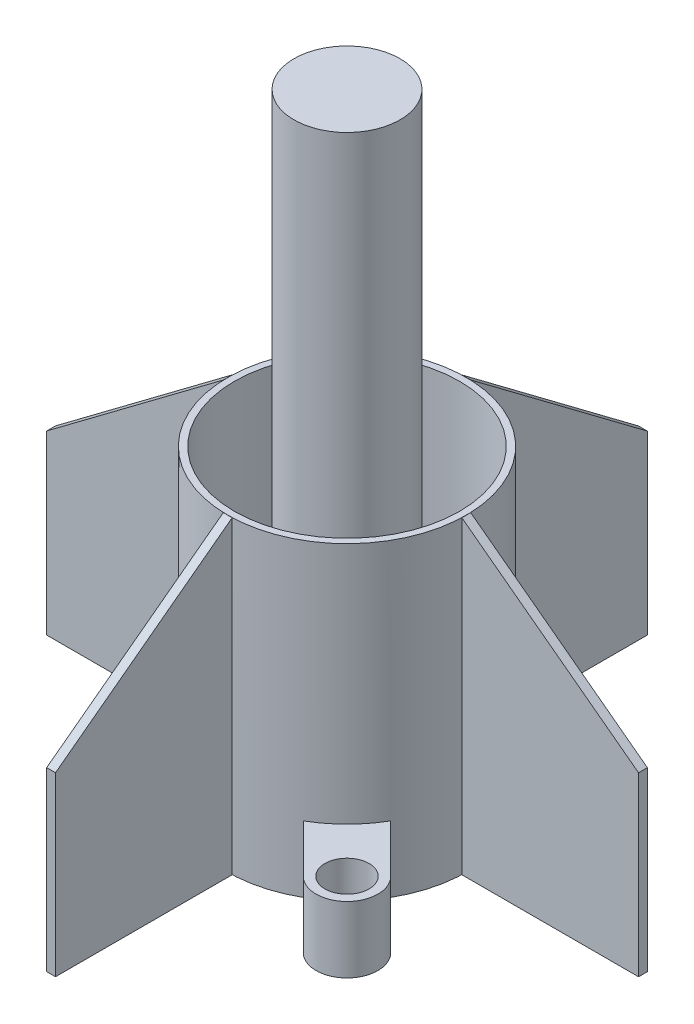
ISO-10303-21;
HEADER;
FILE_DESCRIPTION(('STEP AP214'),'2;1');
FILE_NAME('part.step','',(''),(''),'','','');
FILE_SCHEMA(('AUTOMOTIVE_DESIGN { 1 0 10303 214 1 1 1 1 }'));
ENDSEC;
DATA;
#1=APPLICATION_CONTEXT('core data for automotive mechanical design processes');
#2=APPLICATION_PROTOCOL_DEFINITION('international standard','automotive_design',2000,#1);
#3=PRODUCT_CONTEXT('',#1,'mechanical');
#4=PRODUCT('Part','Part','',(#3));
#5=PRODUCT_RELATED_PRODUCT_CATEGORY('part','',(#4));
#6=PRODUCT_DEFINITION_FORMATION('','',#4);
#7=PRODUCT_DEFINITION_CONTEXT('part definition',#1,'design');
#8=PRODUCT_DEFINITION('design','',#6,#7);
#9=PRODUCT_DEFINITION_SHAPE('','',#8);
#10=(LENGTH_UNIT() NAMED_UNIT(*) SI_UNIT(.MILLI.,.METRE.));
#11=(NAMED_UNIT(*) PLANE_ANGLE_UNIT() SI_UNIT($,.RADIAN.));
#12=(NAMED_UNIT(*) SI_UNIT($,.STERADIAN.) SOLID_ANGLE_UNIT());
#13=UNCERTAINTY_MEASURE_WITH_UNIT(LENGTH_MEASURE(1.E-05),#10,'distance_accuracy_value','');
#14=(GEOMETRIC_REPRESENTATION_CONTEXT(3) GLOBAL_UNCERTAINTY_ASSIGNED_CONTEXT((#13)) GLOBAL_UNIT_ASSIGNED_CONTEXT((#10,
#11,#12)) REPRESENTATION_CONTEXT('',''));
#15=CARTESIAN_POINT('',(0.,0.,0.));
#16=DIRECTION('',(0.,0.,1.));
#17=DIRECTION('',(1.,0.,0.));
#18=AXIS2_PLACEMENT_3D('',#15,#16,#17);
#19=CARTESIAN_POINT('',(1.,0.,-66.9852538505004));
#20=DIRECTION('',(0.,1.,0.));
#21=DIRECTION('',(0.,0.,1.));
#22=AXIS2_PLACEMENT_3D('',#19,#20,#21);
#23=PLANE('',#22);
#24=DIRECTION('',(0.,0.,-1.));
#25=VECTOR('',#24,1.);
#26=CARTESIAN_POINT('',(-1.,0.,-66.9852538505004));
#27=LINE('',#26,#25);
#28=CARTESIAN_POINT('',(-1.,0.,-27.));
#29=VERTEX_POINT('',#28);
#30=CARTESIAN_POINT('',(-1.,0.,-66.9852538505004));
#31=VERTEX_POINT('',#30);
#32=EDGE_CURVE('E115',#29,#31,#27,.T.);
#33=ORIENTED_EDGE('',*,*,#32,.T.);
#34=DIRECTION('',(-1.,0.,0.));
#35=VECTOR('',#34,1.);
#36=CARTESIAN_POINT('',(1.,0.,-66.9852538505004));
#37=LINE('',#36,#35);
#38=CARTESIAN_POINT('',(1.,0.,-66.9852538505004));
#39=VERTEX_POINT('',#38);
#40=EDGE_CURVE('E12',#39,#31,#37,.T.);
#41=ORIENTED_EDGE('',*,*,#40,.F.);
#42=DIRECTION('',(0.,0.,-1.));
#43=VECTOR('',#42,1.);
#44=CARTESIAN_POINT('',(1.,0.,-66.9852538505004));
#45=LINE('',#44,#43);
#46=CARTESIAN_POINT('',(1.,0.,-27.));
#47=VERTEX_POINT('',#46);
#48=EDGE_CURVE('E102',#47,#39,#45,.T.);
#49=ORIENTED_EDGE('',*,*,#48,.F.);
#50=DIRECTION('',(-1.,0.,0.));
#51=VECTOR('',#50,1.);
#52=CARTESIAN_POINT('',(1.,0.,-27.));
#53=LINE('',#52,#51);
#54=EDGE_CURVE('E92',#47,#29,#53,.T.);
#55=ORIENTED_EDGE('',*,*,#54,.T.);
#56=EDGE_LOOP('',(#33,#41,#49,#55));
#57=FACE_BOUND('',#56,.T.);
#58=ADVANCED_FACE('F53',(#57),#23,.F.);
#59=CARTESIAN_POINT('',(1.,40.,-66.9852538505004));
#60=DIRECTION('',(0.,0.,1.));
#61=DIRECTION('',(1.,0.,0.));
#62=AXIS2_PLACEMENT_3D('',#59,#60,#61);
#63=PLANE('',#62);
#64=DIRECTION('',(0.,1.,0.));
#65=VECTOR('',#64,1.);
#66=CARTESIAN_POINT('',(-1.,40.,-66.9852538505004));
#67=LINE('',#66,#65);
#68=CARTESIAN_POINT('',(-1.,40.,-66.9852538505004));
#69=VERTEX_POINT('',#68);
#70=EDGE_CURVE('E107',#31,#69,#67,.T.);
#71=ORIENTED_EDGE('',*,*,#70,.T.);
#72=DIRECTION('',(-1.,0.,0.));
#73=VECTOR('',#72,1.);
#74=CARTESIAN_POINT('',(1.,40.,-66.9852538505004));
#75=LINE('',#74,#73);
#76=CARTESIAN_POINT('',(1.,40.,-66.9852538505004));
#77=VERTEX_POINT('',#76);
#78=EDGE_CURVE('E61',#77,#69,#75,.T.);
#79=ORIENTED_EDGE('',*,*,#78,.F.);
#80=DIRECTION('',(0.,1.,0.));
#81=VECTOR('',#80,1.);
#82=CARTESIAN_POINT('',(1.,40.,-66.9852538505004));
#83=LINE('',#82,#81);
#84=EDGE_CURVE('E98',#39,#77,#83,.T.);
#85=ORIENTED_EDGE('',*,*,#84,.F.);
#86=ORIENTED_EDGE('',*,*,#40,.T.);
#87=EDGE_LOOP('',(#71,#79,#85,#86));
#88=FACE_BOUND('',#87,.T.);
#89=ADVANCED_FACE('F106',(#88),#63,.F.);
#90=CARTESIAN_POINT('',(1.,70.,-27.));
#91=DIRECTION('',(0.,-0.799893790138269,0.600141587042787));
#92=DIRECTION('',(0.,-0.600141587042787,-0.799893790138269));
#93=AXIS2_PLACEMENT_3D('',#90,#91,#92);
#94=PLANE('',#93);
#95=DIRECTION('',(0.,0.600141587042787,0.799893790138268));
#96=VECTOR('',#95,1.);
#97=CARTESIAN_POINT('',(-1.,70.,-27.));
#98=LINE('',#97,#96);
#99=CARTESIAN_POINT('',(-1.,70.,-27.));
#100=VERTEX_POINT('',#99);
#101=EDGE_CURVE('E118',#69,#100,#98,.T.);
#102=ORIENTED_EDGE('',*,*,#101,.T.);
#103=DIRECTION('',(-1.,0.,0.));
#104=VECTOR('',#103,1.);
#105=CARTESIAN_POINT('',(1.,70.,-27.));
#106=LINE('',#105,#104);
#107=CARTESIAN_POINT('',(1.,70.,-27.));
#108=VERTEX_POINT('',#107);
#109=EDGE_CURVE('E85',#108,#100,#106,.T.);
#110=ORIENTED_EDGE('',*,*,#109,.F.);
#111=DIRECTION('',(0.,0.600141587042787,0.799893790138268));
#112=VECTOR('',#111,1.);
#113=CARTESIAN_POINT('',(1.,70.,-27.));
#114=LINE('',#113,#112);
#115=EDGE_CURVE('E101',#77,#108,#114,.T.);
#116=ORIENTED_EDGE('',*,*,#115,.F.);
#117=ORIENTED_EDGE('',*,*,#78,.T.);
#118=EDGE_LOOP('',(#102,#110,#116,#117));
#119=FACE_BOUND('',#118,.T.);
#120=ADVANCED_FACE('F110',(#119),#94,.F.);
#121=CARTESIAN_POINT('',(1.,0.,-27.));
#122=DIRECTION('',(0.,0.,-1.));
#123=DIRECTION('',(-1.,0.,0.));
#124=AXIS2_PLACEMENT_3D('',#121,#122,#123);
#125=PLANE('',#124);
#126=DIRECTION('',(0.,-1.,0.));
#127=VECTOR('',#126,1.);
#128=CARTESIAN_POINT('',(-1.,0.,-27.));
#129=LINE('',#128,#127);
#130=EDGE_CURVE('E120',#100,#29,#129,.T.);
#131=ORIENTED_EDGE('',*,*,#130,.T.);
#132=ORIENTED_EDGE('',*,*,#54,.F.);
#133=DIRECTION('',(0.,-1.,0.));
#134=VECTOR('',#133,1.);
#135=CARTESIAN_POINT('',(1.,0.,-27.));
#136=LINE('',#135,#134);
#137=EDGE_CURVE('E69',#108,#47,#136,.T.);
#138=ORIENTED_EDGE('',*,*,#137,.F.);
#139=ORIENTED_EDGE('',*,*,#109,.T.);
#140=EDGE_LOOP('',(#131,#132,#138,#139));
#141=FACE_BOUND('',#140,.T.);
#142=ADVANCED_FACE('F125',(#141),#125,.F.);
#143=CARTESIAN_POINT('',(1.,0.,0.));
#144=DIRECTION('',(-1.,0.,0.));
#145=DIRECTION('',(0.,0.,1.));
#146=AXIS2_PLACEMENT_3D('',#143,#144,#145);
#147=PLANE('',#146);
#148=ORIENTED_EDGE('',*,*,#48,.T.);
#149=ORIENTED_EDGE('',*,*,#84,.T.);
#150=ORIENTED_EDGE('',*,*,#115,.T.);
#151=ORIENTED_EDGE('',*,*,#137,.T.);
#152=EDGE_LOOP('',(#148,#149,#150,#151));
#153=FACE_BOUND('',#152,.T.);
#154=ADVANCED_FACE('F99',(#153),#147,.F.);
#155=CARTESIAN_POINT('',(-1.,0.,0.));
#156=DIRECTION('',(-1.,0.,0.));
#157=DIRECTION('',(0.,0.,1.));
#158=AXIS2_PLACEMENT_3D('',#155,#156,#157);
#159=PLANE('',#158);
#160=ORIENTED_EDGE('',*,*,#32,.F.);
#161=ORIENTED_EDGE('',*,*,#130,.F.);
#162=ORIENTED_EDGE('',*,*,#101,.F.);
#163=ORIENTED_EDGE('',*,*,#70,.F.);
#164=EDGE_LOOP('',(#160,#161,#162,#163));
#165=FACE_BOUND('',#164,.T.);
#166=ADVANCED_FACE('F127',(#165),#159,.T.);
#167=CLOSED_SHELL('',(#58,#89,#120,#142,#154,#166));
#168=MANIFOLD_SOLID_BREP('B2',#167);
#169=CARTESIAN_POINT('',(1.,0.,27.));
#170=DIRECTION('',(0.,0.,1.));
#171=DIRECTION('',(1.,0.,0.));
#172=AXIS2_PLACEMENT_3D('',#169,#170,#171);
#173=PLANE('',#172);
#174=DIRECTION('',(-1.,0.,0.));
#175=VECTOR('',#174,1.);
#176=CARTESIAN_POINT('',(1.,0.,27.));
#177=LINE('',#176,#175);
#178=CARTESIAN_POINT('',(1.,0.,27.));
#179=VERTEX_POINT('',#178);
#180=CARTESIAN_POINT('',(-1.,0.,27.));
#181=VERTEX_POINT('',#180);
#182=EDGE_CURVE('E227',#179,#181,#177,.T.);
#183=ORIENTED_EDGE('',*,*,#182,.T.);
#184=DIRECTION('',(0.,1.,0.));
#185=VECTOR('',#184,1.);
#186=CARTESIAN_POINT('',(-1.,0.,27.));
#187=LINE('',#186,#185);
#188=CARTESIAN_POINT('',(-1.,70.,27.));
#189=VERTEX_POINT('',#188);
#190=EDGE_CURVE('E250',#181,#189,#187,.T.);
#191=ORIENTED_EDGE('',*,*,#190,.T.);
#192=DIRECTION('',(-1.,0.,0.));
#193=VECTOR('',#192,1.);
#194=CARTESIAN_POINT('',(1.,70.,27.));
#195=LINE('',#194,#193);
#196=CARTESIAN_POINT('',(1.,70.,27.));
#197=VERTEX_POINT('',#196);
#198=EDGE_CURVE('E51',#197,#189,#195,.T.);
#199=ORIENTED_EDGE('',*,*,#198,.F.);
#200=DIRECTION('',(0.,1.,0.));
#201=VECTOR('',#200,1.);
#202=CARTESIAN_POINT('',(1.,0.,27.));
#203=LINE('',#202,#201);
#204=EDGE_CURVE('E238',#179,#197,#203,.T.);
#205=ORIENTED_EDGE('',*,*,#204,.F.);
#206=EDGE_LOOP('',(#183,#191,#199,#205));
#207=FACE_BOUND('',#206,.T.);
#208=ADVANCED_FACE('F188',(#207),#173,.F.);
#209=CARTESIAN_POINT('',(1.,70.,27.));
#210=DIRECTION('',(0.,-0.799893790138269,-0.600141587042787));
#211=DIRECTION('',(0.,0.600141587042787,-0.799893790138269));
#212=AXIS2_PLACEMENT_3D('',#209,#210,#211);
#213=PLANE('',#212);
#214=DIRECTION('',(0.,-0.600141587042787,0.799893790138268));
#215=VECTOR('',#214,1.);
#216=CARTESIAN_POINT('',(-1.,70.,27.));
#217=LINE('',#216,#215);
#218=CARTESIAN_POINT('',(-1.,40.,66.9852538505004));
#219=VERTEX_POINT('',#218);
#220=EDGE_CURVE('E243',#189,#219,#217,.T.);
#221=ORIENTED_EDGE('',*,*,#220,.T.);
#222=DIRECTION('',(-1.,0.,0.));
#223=VECTOR('',#222,1.);
#224=CARTESIAN_POINT('',(1.,40.,66.9852538505004));
#225=LINE('',#224,#223);
#226=CARTESIAN_POINT('',(1.,40.,66.9852538505004));
#227=VERTEX_POINT('',#226);
#228=EDGE_CURVE('E196',#227,#219,#225,.T.);
#229=ORIENTED_EDGE('',*,*,#228,.F.);
#230=DIRECTION('',(0.,-0.600141587042787,0.799893790138268));
#231=VECTOR('',#230,1.);
#232=CARTESIAN_POINT('',(1.,70.,27.));
#233=LINE('',#232,#231);
#234=EDGE_CURVE('E234',#197,#227,#233,.T.);
#235=ORIENTED_EDGE('',*,*,#234,.F.);
#236=ORIENTED_EDGE('',*,*,#198,.T.);
#237=EDGE_LOOP('',(#221,#229,#235,#236));
#238=FACE_BOUND('',#237,.T.);
#239=ADVANCED_FACE('F241',(#238),#213,.F.);
#240=CARTESIAN_POINT('',(1.,40.,66.9852538505004));
#241=DIRECTION('',(0.,0.,-1.));
#242=DIRECTION('',(-1.,0.,0.));
#243=AXIS2_PLACEMENT_3D('',#240,#241,#242);
#244=PLANE('',#243);
#245=DIRECTION('',(0.,-1.,0.));
#246=VECTOR('',#245,1.);
#247=CARTESIAN_POINT('',(-1.,40.,66.9852538505004));
#248=LINE('',#247,#246);
#249=CARTESIAN_POINT('',(-1.,0.,66.9852538505004));
#250=VERTEX_POINT('',#249);
#251=EDGE_CURVE('E220',#219,#250,#248,.T.);
#252=ORIENTED_EDGE('',*,*,#251,.T.);
#253=DIRECTION('',(-1.,0.,0.));
#254=VECTOR('',#253,1.);
#255=CARTESIAN_POINT('',(1.,0.,66.9852538505004));
#256=LINE('',#255,#254);
#257=CARTESIAN_POINT('',(1.,0.,66.9852538505004));
#258=VERTEX_POINT('',#257);
#259=EDGE_CURVE('E244',#258,#250,#256,.T.);
#260=ORIENTED_EDGE('',*,*,#259,.F.);
#261=DIRECTION('',(0.,-1.,0.));
#262=VECTOR('',#261,1.);
#263=CARTESIAN_POINT('',(1.,40.,66.9852538505004));
#264=LINE('',#263,#262);
#265=EDGE_CURVE('E237',#227,#258,#264,.T.);
#266=ORIENTED_EDGE('',*,*,#265,.F.);
#267=ORIENTED_EDGE('',*,*,#228,.T.);
#268=EDGE_LOOP('',(#252,#260,#266,#267));
#269=FACE_BOUND('',#268,.T.);
#270=ADVANCED_FACE('F245',(#269),#244,.F.);
#271=CARTESIAN_POINT('',(1.,0.,66.9852538505004));
#272=DIRECTION('',(0.,1.,0.));
#273=DIRECTION('',(0.,0.,1.));
#274=AXIS2_PLACEMENT_3D('',#271,#272,#273);
#275=PLANE('',#274);
#276=DIRECTION('',(0.,0.,-1.));
#277=VECTOR('',#276,1.);
#278=CARTESIAN_POINT('',(-1.,0.,66.9852538505004));
#279=LINE('',#278,#277);
#280=EDGE_CURVE('E254',#250,#181,#279,.T.);
#281=ORIENTED_EDGE('',*,*,#280,.T.);
#282=ORIENTED_EDGE('',*,*,#182,.F.);
#283=DIRECTION('',(0.,0.,-1.));
#284=VECTOR('',#283,1.);
#285=CARTESIAN_POINT('',(1.,0.,66.9852538505004));
#286=LINE('',#285,#284);
#287=EDGE_CURVE('E204',#258,#179,#286,.T.);
#288=ORIENTED_EDGE('',*,*,#287,.F.);
#289=ORIENTED_EDGE('',*,*,#259,.T.);
#290=EDGE_LOOP('',(#281,#282,#288,#289));
#291=FACE_BOUND('',#290,.T.);
#292=ADVANCED_FACE('F259',(#291),#275,.F.);
#293=CARTESIAN_POINT('',(1.,0.,0.));
#294=DIRECTION('',(-1.,0.,0.));
#295=DIRECTION('',(0.,0.,1.));
#296=AXIS2_PLACEMENT_3D('',#293,#294,#295);
#297=PLANE('',#296);
#298=ORIENTED_EDGE('',*,*,#204,.T.);
#299=ORIENTED_EDGE('',*,*,#234,.T.);
#300=ORIENTED_EDGE('',*,*,#265,.T.);
#301=ORIENTED_EDGE('',*,*,#287,.T.);
#302=EDGE_LOOP('',(#298,#299,#300,#301));
#303=FACE_BOUND('',#302,.T.);
#304=ADVANCED_FACE('F235',(#303),#297,.F.);
#305=CARTESIAN_POINT('',(-1.,0.,0.));
#306=DIRECTION('',(-1.,0.,0.));
#307=DIRECTION('',(0.,0.,1.));
#308=AXIS2_PLACEMENT_3D('',#305,#306,#307);
#309=PLANE('',#308);
#310=ORIENTED_EDGE('',*,*,#190,.F.);
#311=ORIENTED_EDGE('',*,*,#280,.F.);
#312=ORIENTED_EDGE('',*,*,#251,.F.);
#313=ORIENTED_EDGE('',*,*,#220,.F.);
#314=EDGE_LOOP('',(#310,#311,#312,#313));
#315=FACE_BOUND('',#314,.T.);
#316=ADVANCED_FACE('F262',(#315),#309,.T.);
#317=CLOSED_SHELL('',(#208,#239,#270,#292,#304,#316));
#318=MANIFOLD_SOLID_BREP('B6',#317);
#319=CARTESIAN_POINT('',(-67.,40.,1.));
#320=DIRECTION('',(1.,0.,0.));
#321=DIRECTION('',(0.,0.,-1.));
#322=AXIS2_PLACEMENT_3D('',#319,#320,#321);
#323=PLANE('',#322);
#324=DIRECTION('',(0.,-1.,0.));
#325=VECTOR('',#324,1.);
#326=CARTESIAN_POINT('',(-67.,40.,-1.));
#327=LINE('',#326,#325);
#328=CARTESIAN_POINT('',(-67.,40.,-1.));
#329=VERTEX_POINT('',#328);
#330=CARTESIAN_POINT('',(-67.,0.,-1.));
#331=VERTEX_POINT('',#330);
#332=EDGE_CURVE('E385',#329,#331,#327,.T.);
#333=ORIENTED_EDGE('',*,*,#332,.T.);
#334=DIRECTION('',(0.,0.,-1.));
#335=VECTOR('',#334,1.);
#336=CARTESIAN_POINT('',(-67.,0.,1.));
#337=LINE('',#336,#335);
#338=CARTESIAN_POINT('',(-67.,0.,1.));
#339=VERTEX_POINT('',#338);
#340=EDGE_CURVE('E186',#339,#331,#337,.T.);
#341=ORIENTED_EDGE('',*,*,#340,.F.);
#342=DIRECTION('',(0.,-1.,0.));
#343=VECTOR('',#342,1.);
#344=CARTESIAN_POINT('',(-67.,40.,1.));
#345=LINE('',#344,#343);
#346=CARTESIAN_POINT('',(-67.,40.,1.));
#347=VERTEX_POINT('',#346);
#348=EDGE_CURVE('E371',#347,#339,#345,.T.);
#349=ORIENTED_EDGE('',*,*,#348,.F.);
#350=DIRECTION('',(0.,0.,-1.));
#351=VECTOR('',#350,1.);
#352=CARTESIAN_POINT('',(-67.,40.,1.));
#353=LINE('',#352,#351);
#354=EDGE_CURVE('E381',#347,#329,#353,.T.);
#355=ORIENTED_EDGE('',*,*,#354,.T.);
#356=EDGE_LOOP('',(#333,#341,#349,#355));
#357=FACE_BOUND('',#356,.T.);
#358=ADVANCED_FACE('F323',(#357),#323,.F.);
#359=CARTESIAN_POINT('',(-67.,0.,1.));
#360=DIRECTION('',(0.,1.,0.));
#361=DIRECTION('',(-1.,0.,0.));
#362=AXIS2_PLACEMENT_3D('',#359,#360,#361);
#363=PLANE('',#362);
#364=DIRECTION('',(1.,0.,0.));
#365=VECTOR('',#364,1.);
#366=CARTESIAN_POINT('',(-67.,0.,-1.));
#367=LINE('',#366,#365);
#368=CARTESIAN_POINT('',(-27.,0.,-1.));
#369=VERTEX_POINT('',#368);
#370=EDGE_CURVE('E376',#331,#369,#367,.T.);
#371=ORIENTED_EDGE('',*,*,#370,.T.);
#372=DIRECTION('',(0.,0.,-1.));
#373=VECTOR('',#372,1.);
#374=CARTESIAN_POINT('',(-27.,0.,1.));
#375=LINE('',#374,#373);
#376=CARTESIAN_POINT('',(-27.,0.,1.));
#377=VERTEX_POINT('',#376);
#378=EDGE_CURVE('E331',#377,#369,#375,.T.);
#379=ORIENTED_EDGE('',*,*,#378,.F.);
#380=DIRECTION('',(1.,0.,0.));
#381=VECTOR('',#380,1.);
#382=CARTESIAN_POINT('',(-67.,0.,1.));
#383=LINE('',#382,#381);
#384=EDGE_CURVE('E366',#339,#377,#383,.T.);
#385=ORIENTED_EDGE('',*,*,#384,.F.);
#386=ORIENTED_EDGE('',*,*,#340,.T.);
#387=EDGE_LOOP('',(#371,#379,#385,#386));
#388=FACE_BOUND('',#387,.T.);
#389=ADVANCED_FACE('F375',(#388),#363,.F.);
#390=CARTESIAN_POINT('',(-27.,0.,1.));
#391=DIRECTION('',(-1.,0.,0.));
#392=DIRECTION('',(0.,0.,1.));
#393=AXIS2_PLACEMENT_3D('',#390,#391,#392);
#394=PLANE('',#393);
#395=ORIENTED_EDGE('',*,*,#378,.T.);
#396=DIRECTION('',(0.,1.,0.));
#397=VECTOR('',#396,1.);
#398=CARTESIAN_POINT('',(-27.,0.,-1.));
#399=LINE('',#398,#397);
#400=CARTESIAN_POINT('',(-27.,70.,-1.));
#401=VERTEX_POINT('',#400);
#402=EDGE_CURVE('E389',#369,#401,#399,.T.);
#403=ORIENTED_EDGE('',*,*,#402,.T.);
#404=DIRECTION('',(0.,0.,-1.));
#405=VECTOR('',#404,1.);
#406=CARTESIAN_POINT('',(-27.,70.,1.));
#407=LINE('',#406,#405);
#408=CARTESIAN_POINT('',(-27.,70.,1.));
#409=VERTEX_POINT('',#408);
#410=EDGE_CURVE('E355',#409,#401,#407,.T.);
#411=ORIENTED_EDGE('',*,*,#410,.F.);
#412=DIRECTION('',(0.,1.,0.));
#413=VECTOR('',#412,1.);
#414=CARTESIAN_POINT('',(-27.,0.,1.));
#415=LINE('',#414,#413);
#416=EDGE_CURVE('E369',#377,#409,#415,.T.);
#417=ORIENTED_EDGE('',*,*,#416,.F.);
#418=EDGE_LOOP('',(#395,#403,#411,#417));
#419=FACE_BOUND('',#418,.T.);
#420=ADVANCED_FACE('F379',(#419),#394,.F.);
#421=CARTESIAN_POINT('',(-27.,70.,1.));
#422=DIRECTION('',(0.6,-0.8,0.));
#423=DIRECTION('',(0.8,0.6,0.));
#424=AXIS2_PLACEMENT_3D('',#421,#422,#423);
#425=PLANE('',#424);
#426=DIRECTION('',(-0.8,-0.6,0.));
#427=VECTOR('',#426,1.);
#428=CARTESIAN_POINT('',(-27.,70.,-1.));
#429=LINE('',#428,#427);
#430=EDGE_CURVE('E359',#401,#329,#429,.T.);
#431=ORIENTED_EDGE('',*,*,#430,.T.);
#432=ORIENTED_EDGE('',*,*,#354,.F.);
#433=DIRECTION('',(-0.8,-0.6,0.));
#434=VECTOR('',#433,1.);
#435=CARTESIAN_POINT('',(-27.,70.,1.));
#436=LINE('',#435,#434);
#437=EDGE_CURVE('E339',#409,#347,#436,.T.);
#438=ORIENTED_EDGE('',*,*,#437,.F.);
#439=ORIENTED_EDGE('',*,*,#410,.T.);
#440=EDGE_LOOP('',(#431,#432,#438,#439));
#441=FACE_BOUND('',#440,.T.);
#442=ADVANCED_FACE('F402',(#441),#425,.F.);
#443=CARTESIAN_POINT('',(0.,0.,1.));
#444=DIRECTION('',(0.,0.,1.));
#445=DIRECTION('',(1.,0.,0.));
#446=AXIS2_PLACEMENT_3D('',#443,#444,#445);
#447=PLANE('',#446);
#448=ORIENTED_EDGE('',*,*,#348,.T.);
#449=ORIENTED_EDGE('',*,*,#384,.T.);
#450=ORIENTED_EDGE('',*,*,#416,.T.);
#451=ORIENTED_EDGE('',*,*,#437,.T.);
#452=EDGE_LOOP('',(#448,#449,#450,#451));
#453=FACE_BOUND('',#452,.T.);
#454=ADVANCED_FACE('F367',(#453),#447,.T.);
#455=CARTESIAN_POINT('',(0.,0.,-1.));
#456=DIRECTION('',(0.,0.,1.));
#457=DIRECTION('',(1.,0.,0.));
#458=AXIS2_PLACEMENT_3D('',#455,#456,#457);
#459=PLANE('',#458);
#460=ORIENTED_EDGE('',*,*,#332,.F.);
#461=ORIENTED_EDGE('',*,*,#430,.F.);
#462=ORIENTED_EDGE('',*,*,#402,.F.);
#463=ORIENTED_EDGE('',*,*,#370,.F.);
#464=EDGE_LOOP('',(#460,#461,#462,#463));
#465=FACE_BOUND('',#464,.T.);
#466=ADVANCED_FACE('F396',(#465),#459,.F.);
#467=CLOSED_SHELL('',(#358,#389,#420,#442,#454,#466));
#468=MANIFOLD_SOLID_BREP('B45',#467);
#469=CARTESIAN_POINT('',(27.,0.,1.));
#470=DIRECTION('',(1.,0.,0.));
#471=DIRECTION('',(0.,0.,-1.));
#472=AXIS2_PLACEMENT_3D('',#469,#470,#471);
#473=PLANE('',#472);
#474=DIRECTION('',(0.,-1.,0.));
#475=VECTOR('',#474,1.);
#476=CARTESIAN_POINT('',(27.,0.,-1.));
#477=LINE('',#476,#475);
#478=CARTESIAN_POINT('',(27.,70.,-1.));
#479=VERTEX_POINT('',#478);
#480=CARTESIAN_POINT('',(27.,0.,-1.));
#481=VERTEX_POINT('',#480);
#482=EDGE_CURVE('E521',#479,#481,#477,.T.);
#483=ORIENTED_EDGE('',*,*,#482,.T.);
#484=DIRECTION('',(0.,0.,-1.));
#485=VECTOR('',#484,1.);
#486=CARTESIAN_POINT('',(27.,0.,1.));
#487=LINE('',#486,#485);
#488=CARTESIAN_POINT('',(27.,0.,1.));
#489=VERTEX_POINT('',#488);
#490=EDGE_CURVE('E321',#489,#481,#487,.T.);
#491=ORIENTED_EDGE('',*,*,#490,.F.);
#492=DIRECTION('',(0.,-1.,0.));
#493=VECTOR('',#492,1.);
#494=CARTESIAN_POINT('',(27.,0.,1.));
#495=LINE('',#494,#493);
#496=CARTESIAN_POINT('',(27.,70.,1.));
#497=VERTEX_POINT('',#496);
#498=EDGE_CURVE('E509',#497,#489,#495,.T.);
#499=ORIENTED_EDGE('',*,*,#498,.F.);
#500=DIRECTION('',(0.,0.,-1.));
#501=VECTOR('',#500,1.);
#502=CARTESIAN_POINT('',(27.,70.,1.));
#503=LINE('',#502,#501);
#504=EDGE_CURVE('E498',#497,#479,#503,.T.);
#505=ORIENTED_EDGE('',*,*,#504,.T.);
#506=EDGE_LOOP('',(#483,#491,#499,#505));
#507=FACE_BOUND('',#506,.T.);
#508=ADVANCED_FACE('F459',(#507),#473,.F.);
#509=CARTESIAN_POINT('',(67.,0.,1.));
#510=DIRECTION('',(0.,1.,0.));
#511=DIRECTION('',(-1.,0.,0.));
#512=AXIS2_PLACEMENT_3D('',#509,#510,#511);
#513=PLANE('',#512);
#514=DIRECTION('',(1.,0.,0.));
#515=VECTOR('',#514,1.);
#516=CARTESIAN_POINT('',(67.,0.,-1.));
#517=LINE('',#516,#515);
#518=CARTESIAN_POINT('',(67.,0.,-1.));
#519=VERTEX_POINT('',#518);
#520=EDGE_CURVE('E514',#481,#519,#517,.T.);
#521=ORIENTED_EDGE('',*,*,#520,.T.);
#522=DIRECTION('',(0.,0.,-1.));
#523=VECTOR('',#522,1.);
#524=CARTESIAN_POINT('',(67.,0.,1.));
#525=LINE('',#524,#523);
#526=CARTESIAN_POINT('',(67.,0.,1.));
#527=VERTEX_POINT('',#526);
#528=EDGE_CURVE('E467',#527,#519,#525,.T.);
#529=ORIENTED_EDGE('',*,*,#528,.F.);
#530=DIRECTION('',(1.,0.,0.));
#531=VECTOR('',#530,1.);
#532=CARTESIAN_POINT('',(67.,0.,1.));
#533=LINE('',#532,#531);
#534=EDGE_CURVE('E505',#489,#527,#533,.T.);
#535=ORIENTED_EDGE('',*,*,#534,.F.);
#536=ORIENTED_EDGE('',*,*,#490,.T.);
#537=EDGE_LOOP('',(#521,#529,#535,#536));
#538=FACE_BOUND('',#537,.T.);
#539=ADVANCED_FACE('F512',(#538),#513,.F.);
#540=CARTESIAN_POINT('',(67.,40.,1.));
#541=DIRECTION('',(-1.,0.,0.));
#542=DIRECTION('',(0.,0.,1.));
#543=AXIS2_PLACEMENT_3D('',#540,#541,#542);
#544=PLANE('',#543);
#545=DIRECTION('',(0.,1.,0.));
#546=VECTOR('',#545,1.);
#547=CARTESIAN_POINT('',(67.,40.,-1.));
#548=LINE('',#547,#546);
#549=CARTESIAN_POINT('',(67.,40.,-1.));
#550=VERTEX_POINT('',#549);
#551=EDGE_CURVE('E491',#519,#550,#548,.T.);
#552=ORIENTED_EDGE('',*,*,#551,.T.);
#553=DIRECTION('',(0.,0.,-1.));
#554=VECTOR('',#553,1.);
#555=CARTESIAN_POINT('',(67.,40.,1.));
#556=LINE('',#555,#554);
#557=CARTESIAN_POINT('',(67.,40.,1.));
#558=VERTEX_POINT('',#557);
#559=EDGE_CURVE('E515',#558,#550,#556,.T.);
#560=ORIENTED_EDGE('',*,*,#559,.F.);
#561=DIRECTION('',(0.,1.,0.));
#562=VECTOR('',#561,1.);
#563=CARTESIAN_POINT('',(67.,40.,1.));
#564=LINE('',#563,#562);
#565=EDGE_CURVE('E508',#527,#558,#564,.T.);
#566=ORIENTED_EDGE('',*,*,#565,.F.);
#567=ORIENTED_EDGE('',*,*,#528,.T.);
#568=EDGE_LOOP('',(#552,#560,#566,#567));
#569=FACE_BOUND('',#568,.T.);
#570=ADVANCED_FACE('F516',(#569),#544,.F.);
#571=CARTESIAN_POINT('',(27.,70.,1.));
#572=DIRECTION('',(-0.6,-0.8,0.));
#573=DIRECTION('',(0.8,-0.6,0.));
#574=AXIS2_PLACEMENT_3D('',#571,#572,#573);
#575=PLANE('',#574);
#576=DIRECTION('',(-0.8,0.6,0.));
#577=VECTOR('',#576,1.);
#578=CARTESIAN_POINT('',(27.,70.,-1.));
#579=LINE('',#578,#577);
#580=EDGE_CURVE('E525',#550,#479,#579,.T.);
#581=ORIENTED_EDGE('',*,*,#580,.T.);
#582=ORIENTED_EDGE('',*,*,#504,.F.);
#583=DIRECTION('',(-0.8,0.6,0.));
#584=VECTOR('',#583,1.);
#585=CARTESIAN_POINT('',(27.,70.,1.));
#586=LINE('',#585,#584);
#587=EDGE_CURVE('E475',#558,#497,#586,.T.);
#588=ORIENTED_EDGE('',*,*,#587,.F.);
#589=ORIENTED_EDGE('',*,*,#559,.T.);
#590=EDGE_LOOP('',(#581,#582,#588,#589));
#591=FACE_BOUND('',#590,.T.);
#592=ADVANCED_FACE('F530',(#591),#575,.F.);
#593=CARTESIAN_POINT('',(0.,0.,1.));
#594=DIRECTION('',(0.,0.,1.));
#595=DIRECTION('',(1.,0.,0.));
#596=AXIS2_PLACEMENT_3D('',#593,#594,#595);
#597=PLANE('',#596);
#598=ORIENTED_EDGE('',*,*,#498,.T.);
#599=ORIENTED_EDGE('',*,*,#534,.T.);
#600=ORIENTED_EDGE('',*,*,#565,.T.);
#601=ORIENTED_EDGE('',*,*,#587,.T.);
#602=EDGE_LOOP('',(#598,#599,#600,#601));
#603=FACE_BOUND('',#602,.T.);
#604=ADVANCED_FACE('F506',(#603),#597,.T.);
#605=CARTESIAN_POINT('',(0.,0.,-1.));
#606=DIRECTION('',(0.,0.,1.));
#607=DIRECTION('',(1.,0.,0.));
#608=AXIS2_PLACEMENT_3D('',#605,#606,#607);
#609=PLANE('',#608);
#610=ORIENTED_EDGE('',*,*,#482,.F.);
#611=ORIENTED_EDGE('',*,*,#580,.F.);
#612=ORIENTED_EDGE('',*,*,#551,.F.);
#613=ORIENTED_EDGE('',*,*,#520,.F.);
#614=EDGE_LOOP('',(#610,#611,#612,#613));
#615=FACE_BOUND('',#614,.T.);
#616=ADVANCED_FACE('F533',(#615),#609,.F.);
#617=CLOSED_SHELL('',(#508,#539,#570,#592,#604,#616));
#618=MANIFOLD_SOLID_BREP('B180',#617);
#619=CARTESIAN_POINT('',(0.,70.,0.));
#620=DIRECTION('',(0.,-1.,0.));
#621=DIRECTION('',(0.,0.,-1.));
#622=AXIS2_PLACEMENT_3D('',#619,#620,#621);
#623=CYLINDRICAL_SURFACE('',#622,25.5);
#624=CARTESIAN_POINT('',(0.,70.,0.));
#625=DIRECTION('',(0.,-1.,0.));
#626=DIRECTION('',(0.,0.,-1.));
#627=AXIS2_PLACEMENT_3D('',#624,#625,#626);
#628=CIRCLE('',#627,25.5);
#629=CARTESIAN_POINT('',(0.,70.,-25.5));
#630=VERTEX_POINT('',#629);
#631=EDGE_CURVE('E728',#630,#630,#628,.T.);
#632=ORIENTED_EDGE('',*,*,#631,.F.);
#633=EDGE_LOOP('',(#632));
#634=FACE_BOUND('',#633,.T.);
#635=CARTESIAN_POINT('',(0.,4.,0.));
#636=DIRECTION('',(0.,-1.,0.));
#637=DIRECTION('',(0.,0.,-1.));
#638=AXIS2_PLACEMENT_3D('',#635,#636,#637);
#639=CIRCLE('',#638,25.5);
#640=CARTESIAN_POINT('',(0.,4.,-25.5));
#641=VERTEX_POINT('',#640);
#642=EDGE_CURVE('E735',#641,#641,#639,.F.);
#643=ORIENTED_EDGE('',*,*,#642,.F.);
#644=EDGE_LOOP('',(#643));
#645=FACE_BOUND('',#644,.T.);
#646=ADVANCED_FACE('F591',(#634,#645),#623,.F.);
#647=CARTESIAN_POINT('',(0.,70.,0.));
#648=DIRECTION('',(0.,-1.,0.));
#649=DIRECTION('',(0.,0.,-1.));
#650=AXIS2_PLACEMENT_3D('',#647,#648,#649);
#651=CYLINDRICAL_SURFACE('',#650,27.);
#652=CARTESIAN_POINT('',(0.,0.,0.));
#653=DIRECTION('',(0.,1.,0.));
#654=DIRECTION('',(0.,0.,1.));
#655=AXIS2_PLACEMENT_3D('',#652,#653,#654);
#656=CIRCLE('',#655,27.);
#657=CARTESIAN_POINT('',(23.3888363828916,0.,13.48934144628));
#658=VERTEX_POINT('',#657);
#659=CARTESIAN_POINT('',(-13.4893414462799,0.,-23.3888363828916));
#660=VERTEX_POINT('',#659);
#661=EDGE_CURVE('E736',#658,#660,#656,.T.);
#662=ORIENTED_EDGE('',*,*,#661,.T.);
#663=DIRECTION('',(0.,-1.,0.));
#664=VECTOR('',#663,1.);
#665=CARTESIAN_POINT('',(-13.4893414462799,15.,-23.3888363828916));
#666=LINE('',#665,#664);
#667=CARTESIAN_POINT('',(-13.4893414462799,15.,-23.3888363828916));
#668=VERTEX_POINT('',#667);
#669=EDGE_CURVE('E606',#668,#660,#666,.T.);
#670=ORIENTED_EDGE('',*,*,#669,.F.);
#671=CARTESIAN_POINT('',(0.,15.,0.));
#672=DIRECTION('',(0.,-1.,0.));
#673=DIRECTION('',(0.,0.,-1.));
#674=AXIS2_PLACEMENT_3D('',#671,#672,#673);
#675=CIRCLE('',#674,27.);
#676=CARTESIAN_POINT('',(-23.3888363828916,15.,-13.48934144628));
#677=VERTEX_POINT('',#676);
#678=EDGE_CURVE('E457',#677,#668,#675,.T.);
#679=ORIENTED_EDGE('',*,*,#678,.F.);
#680=DIRECTION('',(0.,-1.,0.));
#681=VECTOR('',#680,1.);
#682=CARTESIAN_POINT('',(-23.3888363828916,15.,-13.48934144628));
#683=LINE('',#682,#681);
#684=CARTESIAN_POINT('',(-23.3888363828916,0.,-13.48934144628));
#685=VERTEX_POINT('',#684);
#686=EDGE_CURVE('E665',#677,#685,#683,.T.);
#687=ORIENTED_EDGE('',*,*,#686,.T.);
#688=CARTESIAN_POINT('',(13.4893414462799,0.,23.3888363828916));
#689=VERTEX_POINT('',#688);
#690=EDGE_CURVE('E731',#685,#689,#656,.T.);
#691=ORIENTED_EDGE('',*,*,#690,.T.);
#692=DIRECTION('',(0.,-1.,0.));
#693=VECTOR('',#692,1.);
#694=CARTESIAN_POINT('',(13.4893414462799,15.,23.3888363828916));
#695=LINE('',#694,#693);
#696=CARTESIAN_POINT('',(13.4893414462799,15.,23.3888363828916));
#697=VERTEX_POINT('',#696);
#698=EDGE_CURVE('E710',#697,#689,#695,.T.);
#699=ORIENTED_EDGE('',*,*,#698,.F.);
#700=CARTESIAN_POINT('',(0.,15.,0.));
#701=DIRECTION('',(0.,1.,0.));
#702=DIRECTION('',(0.,0.,1.));
#703=AXIS2_PLACEMENT_3D('',#700,#701,#702);
#704=CIRCLE('',#703,27.);
#705=CARTESIAN_POINT('',(23.3888363828916,15.,13.48934144628));
#706=VERTEX_POINT('',#705);
#707=EDGE_CURVE('E599',#697,#706,#704,.T.);
#708=ORIENTED_EDGE('',*,*,#707,.T.);
#709=DIRECTION('',(0.,-1.,0.));
#710=VECTOR('',#709,1.);
#711=CARTESIAN_POINT('',(23.3888363828916,15.,13.48934144628));
#712=LINE('',#711,#710);
#713=EDGE_CURVE('E702',#706,#658,#712,.T.);
#714=ORIENTED_EDGE('',*,*,#713,.T.);
#715=EDGE_LOOP('',(#662,#670,#679,#687,#691,#699,#708,#714));
#716=FACE_BOUND('',#715,.T.);
#717=CARTESIAN_POINT('',(0.,70.,0.));
#718=DIRECTION('',(0.,1.,0.));
#719=DIRECTION('',(0.,0.,1.));
#720=AXIS2_PLACEMENT_3D('',#717,#718,#719);
#721=CIRCLE('',#720,27.);
#722=CARTESIAN_POINT('',(0.,70.,27.));
#723=VERTEX_POINT('',#722);
#724=EDGE_CURVE('E732',#723,#723,#721,.T.);
#725=ORIENTED_EDGE('',*,*,#724,.F.);
#726=EDGE_LOOP('',(#725));
#727=FACE_BOUND('',#726,.T.);
#728=ADVANCED_FACE('F747',(#716,#727),#651,.T.);
#729=CARTESIAN_POINT('',(0.,70.,0.));
#730=DIRECTION('',(0.,1.,0.));
#731=DIRECTION('',(0.,0.,1.));
#732=AXIS2_PLACEMENT_3D('',#729,#730,#731);
#733=PLANE('',#732);
#734=ORIENTED_EDGE('',*,*,#631,.T.);
#735=EDGE_LOOP('',(#734));
#736=FACE_BOUND('',#735,.T.);
#737=ORIENTED_EDGE('',*,*,#724,.T.);
#738=EDGE_LOOP('',(#737));
#739=FACE_BOUND('',#738,.T.);
#740=ADVANCED_FACE('F784',(#736,#739),#733,.T.);
#741=CARTESIAN_POINT('',(0.,0.,0.));
#742=DIRECTION('',(0.,1.,0.));
#743=DIRECTION('',(0.,0.,1.));
#744=AXIS2_PLACEMENT_3D('',#741,#742,#743);
#745=PLANE('',#744);
#746=CARTESIAN_POINT('',(29.2831009286926,0.,29.2831009286927));
#747=DIRECTION('',(0.,-1.,0.));
#748=DIRECTION('',(0.,0.,-1.));
#749=AXIS2_PLACEMENT_3D('',#746,#747,#748);
#750=CIRCLE('',#749,5.);
#751=CARTESIAN_POINT('',(29.2831009286926,0.,24.2831009286927));
#752=VERTEX_POINT('',#751);
#753=EDGE_CURVE('E804',#752,#752,#750,.T.);
#754=ORIENTED_EDGE('',*,*,#753,.F.);
#755=EDGE_LOOP('',(#754));
#756=FACE_BOUND('',#755,.T.);
#757=CARTESIAN_POINT('',(-29.2831009286927,0.,-29.2831009286926));
#758=DIRECTION('',(0.,-1.,0.));
#759=DIRECTION('',(0.,0.,1.));
#760=AXIS2_PLACEMENT_3D('',#757,#758,#759);
#761=CIRCLE('',#760,5.);
#762=CARTESIAN_POINT('',(-29.2831009286927,0.,-24.2831009286926));
#763=VERTEX_POINT('',#762);
#764=EDGE_CURVE('E808',#763,#763,#761,.T.);
#765=ORIENTED_EDGE('',*,*,#764,.F.);
#766=EDGE_LOOP('',(#765));
#767=FACE_BOUND('',#766,.T.);
#768=CARTESIAN_POINT('',(0.,0.,0.));
#769=DIRECTION('',(0.,-1.,0.));
#770=DIRECTION('',(0.,0.,-1.));
#771=AXIS2_PLACEMENT_3D('',#768,#769,#770);
#772=CIRCLE('',#771,10.5);
#773=CARTESIAN_POINT('',(0.,0.,-10.5));
#774=VERTEX_POINT('',#773);
#775=EDGE_CURVE('E713',#774,#774,#772,.T.);
#776=ORIENTED_EDGE('',*,*,#775,.F.);
#777=EDGE_LOOP('',(#776));
#778=FACE_BOUND('',#777,.T.);
#779=ORIENTED_EDGE('',*,*,#690,.F.);
#780=DIRECTION('',(-0.707106781186546,0.,-0.707106781186549));
#781=VECTOR('',#780,1.);
#782=CARTESIAN_POINT('',(-23.3888363828916,0.,-13.48934144628));
#783=LINE('',#782,#781);
#784=CARTESIAN_POINT('',(-34.2328483969984,0.,-24.3333534603869));
#785=VERTEX_POINT('',#784);
#786=EDGE_CURVE('E684',#685,#785,#783,.T.);
#787=ORIENTED_EDGE('',*,*,#786,.T.);
#788=CARTESIAN_POINT('',(-29.2831009286926,0.,-29.2831009286927));
#789=DIRECTION('',(0.,-1.,0.));
#790=DIRECTION('',(0.,0.,-1.));
#791=AXIS2_PLACEMENT_3D('',#788,#789,#790);
#792=CIRCLE('',#791,7.);
#793=CARTESIAN_POINT('',(-24.3333534603867,0.,-34.2328483969985));
#794=VERTEX_POINT('',#793);
#795=EDGE_CURVE('E659',#785,#794,#792,.T.);
#796=ORIENTED_EDGE('',*,*,#795,.T.);
#797=DIRECTION('',(0.707106781186546,0.,0.707106781186549));
#798=VECTOR('',#797,1.);
#799=CARTESIAN_POINT('',(-13.4893414462799,0.,-23.3888363828916));
#800=LINE('',#799,#798);
#801=EDGE_CURVE('E675',#794,#660,#800,.T.);
#802=ORIENTED_EDGE('',*,*,#801,.T.);
#803=ORIENTED_EDGE('',*,*,#661,.F.);
#804=DIRECTION('',(0.707106781186546,0.,0.707106781186549));
#805=VECTOR('',#804,1.);
#806=CARTESIAN_POINT('',(23.3888363828916,0.,13.48934144628));
#807=LINE('',#806,#805);
#808=CARTESIAN_POINT('',(34.2328483969984,0.,24.3333534603869));
#809=VERTEX_POINT('',#808);
#810=EDGE_CURVE('E689',#658,#809,#807,.T.);
#811=ORIENTED_EDGE('',*,*,#810,.T.);
#812=CARTESIAN_POINT('',(29.2831009286926,0.,29.2831009286927));
#813=DIRECTION('',(0.,-1.,0.));
#814=DIRECTION('',(0.,0.,1.));
#815=AXIS2_PLACEMENT_3D('',#812,#813,#814);
#816=CIRCLE('',#815,7.);
#817=CARTESIAN_POINT('',(24.3333534603867,0.,34.2328483969985));
#818=VERTEX_POINT('',#817);
#819=EDGE_CURVE('E705',#809,#818,#816,.T.);
#820=ORIENTED_EDGE('',*,*,#819,.T.);
#821=DIRECTION('',(-0.707106781186546,0.,-0.707106781186549));
#822=VECTOR('',#821,1.);
#823=CARTESIAN_POINT('',(13.4893414462799,0.,23.3888363828916));
#824=LINE('',#823,#822);
#825=EDGE_CURVE('E696',#818,#689,#824,.T.);
#826=ORIENTED_EDGE('',*,*,#825,.T.);
#827=EDGE_LOOP('',(#779,#787,#796,#802,#803,#811,#820,#826));
#828=FACE_BOUND('',#827,.T.);
#829=ADVANCED_FACE('F762',(#756,#767,#778,#828),#745,.F.);
#830=CARTESIAN_POINT('',(0.,4.,0.));
#831=DIRECTION('',(0.,-1.,0.));
#832=DIRECTION('',(0.,0.,-1.));
#833=AXIS2_PLACEMENT_3D('',#830,#831,#832);
#834=PLANE('',#833);
#835=CARTESIAN_POINT('',(0.,4.,0.));
#836=DIRECTION('',(0.,-1.,0.));
#837=DIRECTION('',(0.,0.,-1.));
#838=AXIS2_PLACEMENT_3D('',#835,#836,#837);
#839=CIRCLE('',#838,22.);
#840=CARTESIAN_POINT('',(0.,4.,-22.));
#841=VERTEX_POINT('',#840);
#842=EDGE_CURVE('E740',#841,#841,#839,.T.);
#843=ORIENTED_EDGE('',*,*,#842,.T.);
#844=EDGE_LOOP('',(#843));
#845=FACE_BOUND('',#844,.T.);
#846=ORIENTED_EDGE('',*,*,#642,.T.);
#847=EDGE_LOOP('',(#846));
#848=FACE_BOUND('',#847,.T.);
#849=ADVANCED_FACE('F789',(#845,#848),#834,.F.);
#850=CARTESIAN_POINT('',(0.,140.,0.));
#851=DIRECTION('',(0.,-1.,0.));
#852=DIRECTION('',(0.,0.,-1.));
#853=AXIS2_PLACEMENT_3D('',#850,#851,#852);
#854=CYLINDRICAL_SURFACE('',#853,12.);
#855=CARTESIAN_POINT('',(0.,14.,0.));
#856=DIRECTION('',(0.,-1.,0.));
#857=DIRECTION('',(0.,0.,-1.));
#858=AXIS2_PLACEMENT_3D('',#855,#856,#857);
#859=CIRCLE('',#858,12.);
#860=CARTESIAN_POINT('',(0.,14.,-12.));
#861=VERTEX_POINT('',#860);
#862=EDGE_CURVE('E743',#861,#861,#859,.F.);
#863=ORIENTED_EDGE('',*,*,#862,.T.);
#864=EDGE_LOOP('',(#863));
#865=FACE_BOUND('',#864,.T.);
#866=CARTESIAN_POINT('',(0.,140.,0.));
#867=DIRECTION('',(0.,-1.,0.));
#868=DIRECTION('',(0.,0.,-1.));
#869=AXIS2_PLACEMENT_3D('',#866,#867,#868);
#870=CIRCLE('',#869,12.);
#871=CARTESIAN_POINT('',(0.,140.,-12.));
#872=VERTEX_POINT('',#871);
#873=EDGE_CURVE('E723',#872,#872,#870,.T.);
#874=ORIENTED_EDGE('',*,*,#873,.T.);
#875=EDGE_LOOP('',(#874));
#876=FACE_BOUND('',#875,.T.);
#877=ADVANCED_FACE('F799',(#865,#876),#854,.T.);
#878=CARTESIAN_POINT('',(0.,140.,0.));
#879=DIRECTION('',(0.,-1.,0.));
#880=DIRECTION('',(0.,0.,-1.));
#881=AXIS2_PLACEMENT_3D('',#878,#879,#880);
#882=PLANE('',#881);
#883=ORIENTED_EDGE('',*,*,#873,.F.);
#884=EDGE_LOOP('',(#883));
#885=FACE_BOUND('',#884,.T.);
#886=ADVANCED_FACE('F813',(#885),#882,.F.);
#887=CARTESIAN_POINT('',(0.,125.,0.));
#888=DIRECTION('',(0.,-1.,0.));
#889=DIRECTION('',(0.,0.,-1.));
#890=AXIS2_PLACEMENT_3D('',#887,#888,#889);
#891=CYLINDRICAL_SURFACE('',#890,10.5);
#892=CARTESIAN_POINT('',(0.,125.,0.));
#893=DIRECTION('',(0.,-1.,0.));
#894=DIRECTION('',(0.,0.,-1.));
#895=AXIS2_PLACEMENT_3D('',#892,#893,#894);
#896=CIRCLE('',#895,10.5);
#897=CARTESIAN_POINT('',(0.,125.,-10.5));
#898=VERTEX_POINT('',#897);
#899=EDGE_CURVE('E720',#898,#898,#896,.T.);
#900=ORIENTED_EDGE('',*,*,#899,.F.);
#901=EDGE_LOOP('',(#900));
#902=FACE_BOUND('',#901,.T.);
#903=ORIENTED_EDGE('',*,*,#775,.T.);
#904=EDGE_LOOP('',(#903));
#905=FACE_BOUND('',#904,.T.);
#906=ADVANCED_FACE('F811',(#902,#905),#891,.F.);
#907=CARTESIAN_POINT('',(0.,125.,0.));
#908=DIRECTION('',(0.,-1.,0.));
#909=DIRECTION('',(0.,0.,-1.));
#910=AXIS2_PLACEMENT_3D('',#907,#908,#909);
#911=PLANE('',#910);
#912=ORIENTED_EDGE('',*,*,#899,.T.);
#913=EDGE_LOOP('',(#912));
#914=FACE_BOUND('',#913,.T.);
#915=ADVANCED_FACE('F775',(#914),#911,.T.);
#916=CARTESIAN_POINT('',(0.,14.,0.));
#917=DIRECTION('',(0.,-1.,0.));
#918=DIRECTION('',(0.,0.,-1.));
#919=AXIS2_PLACEMENT_3D('',#916,#917,#918);
#920=TOROIDAL_SURFACE('',#919,22.,10.);
#921=ORIENTED_EDGE('',*,*,#862,.F.);
#922=EDGE_LOOP('',(#921));
#923=FACE_BOUND('',#922,.T.);
#924=ORIENTED_EDGE('',*,*,#842,.F.);
#925=EDGE_LOOP('',(#924));
#926=FACE_BOUND('',#925,.T.);
#927=ADVANCED_FACE('F593',(#923,#926),#920,.F.);
#928=CARTESIAN_POINT('',(13.4893414462799,15.,23.3888363828916));
#929=DIRECTION('',(-0.707106781186549,0.,0.707106781186546));
#930=DIRECTION('',(0.707106781186546,0.,0.707106781186549));
#931=AXIS2_PLACEMENT_3D('',#928,#929,#930);
#932=PLANE('',#931);
#933=ORIENTED_EDGE('',*,*,#825,.F.);
#934=DIRECTION('',(0.,-1.,0.));
#935=VECTOR('',#934,1.);
#936=CARTESIAN_POINT('',(24.3333534603867,15.,34.2328483969985));
#937=LINE('',#936,#935);
#938=CARTESIAN_POINT('',(24.3333534603867,15.,34.2328483969985));
#939=VERTEX_POINT('',#938);
#940=EDGE_CURVE('E714',#939,#818,#937,.T.);
#941=ORIENTED_EDGE('',*,*,#940,.F.);
#942=DIRECTION('',(-0.707106781186546,0.,-0.707106781186549));
#943=VECTOR('',#942,1.);
#944=CARTESIAN_POINT('',(13.4893414462799,15.,23.3888363828916));
#945=LINE('',#944,#943);
#946=EDGE_CURVE('E699',#939,#697,#945,.T.);
#947=ORIENTED_EDGE('',*,*,#946,.T.);
#948=ORIENTED_EDGE('',*,*,#698,.T.);
#949=EDGE_LOOP('',(#933,#941,#947,#948));
#950=FACE_BOUND('',#949,.T.);
#951=ADVANCED_FACE('F767',(#950),#932,.T.);
#952=CARTESIAN_POINT('',(29.2831009286926,15.,29.2831009286927));
#953=DIRECTION('',(0.,-1.,0.));
#954=DIRECTION('',(0.,0.,-1.));
#955=AXIS2_PLACEMENT_3D('',#952,#953,#954);
#956=CYLINDRICAL_SURFACE('',#955,7.);
#957=ORIENTED_EDGE('',*,*,#819,.F.);
#958=DIRECTION('',(0.,-1.,0.));
#959=VECTOR('',#958,1.);
#960=CARTESIAN_POINT('',(34.2328483969984,15.,24.3333534603869));
#961=LINE('',#960,#959);
#962=CARTESIAN_POINT('',(34.2328483969984,15.,24.3333534603869));
#963=VERTEX_POINT('',#962);
#964=EDGE_CURVE('E716',#963,#809,#961,.T.);
#965=ORIENTED_EDGE('',*,*,#964,.F.);
#966=CARTESIAN_POINT('',(29.2831009286926,15.,29.2831009286927));
#967=DIRECTION('',(0.,-1.,0.));
#968=DIRECTION('',(0.,0.,1.));
#969=AXIS2_PLACEMENT_3D('',#966,#967,#968);
#970=CIRCLE('',#969,7.);
#971=EDGE_CURVE('E695',#963,#939,#970,.T.);
#972=ORIENTED_EDGE('',*,*,#971,.T.);
#973=ORIENTED_EDGE('',*,*,#940,.T.);
#974=EDGE_LOOP('',(#957,#965,#972,#973));
#975=FACE_BOUND('',#974,.T.);
#976=ADVANCED_FACE('F759',(#975),#956,.T.);
#977=CARTESIAN_POINT('',(23.3888363828916,15.,13.48934144628));
#978=DIRECTION('',(0.707106781186549,0.,-0.707106781186546));
#979=DIRECTION('',(-0.707106781186546,0.,-0.707106781186549));
#980=AXIS2_PLACEMENT_3D('',#977,#978,#979);
#981=PLANE('',#980);
#982=ORIENTED_EDGE('',*,*,#810,.F.);
#983=ORIENTED_EDGE('',*,*,#713,.F.);
#984=DIRECTION('',(0.707106781186546,0.,0.707106781186549));
#985=VECTOR('',#984,1.);
#986=CARTESIAN_POINT('',(23.3888363828916,15.,13.48934144628));
#987=LINE('',#986,#985);
#988=EDGE_CURVE('E692',#706,#963,#987,.T.);
#989=ORIENTED_EDGE('',*,*,#988,.T.);
#990=ORIENTED_EDGE('',*,*,#964,.T.);
#991=EDGE_LOOP('',(#982,#983,#989,#990));
#992=FACE_BOUND('',#991,.T.);
#993=ADVANCED_FACE('F754',(#992),#981,.T.);
#994=CARTESIAN_POINT('',(29.2831009286926,15.,29.2831009286927));
#995=DIRECTION('',(0.,1.,0.));
#996=DIRECTION('',(0.,0.,1.));
#997=AXIS2_PLACEMENT_3D('',#994,#995,#996);
#998=PLANE('',#997);
#999=CARTESIAN_POINT('',(29.2831009286926,15.,29.2831009286927));
#1000=DIRECTION('',(0.,1.,0.));
#1001=DIRECTION('',(0.,0.,1.));
#1002=AXIS2_PLACEMENT_3D('',#999,#1000,#1001);
#1003=CIRCLE('',#1002,5.);
#1004=CARTESIAN_POINT('',(29.2831009286926,15.,34.2831009286927));
#1005=VERTEX_POINT('',#1004);
#1006=EDGE_CURVE('E686',#1005,#1005,#1003,.F.);
#1007=ORIENTED_EDGE('',*,*,#1006,.T.);
#1008=EDGE_LOOP('',(#1007));
#1009=FACE_BOUND('',#1008,.T.);
#1010=ORIENTED_EDGE('',*,*,#707,.F.);
#1011=ORIENTED_EDGE('',*,*,#946,.F.);
#1012=ORIENTED_EDGE('',*,*,#971,.F.);
#1013=ORIENTED_EDGE('',*,*,#988,.F.);
#1014=EDGE_LOOP('',(#1010,#1011,#1012,#1013));
#1015=FACE_BOUND('',#1014,.T.);
#1016=ADVANCED_FACE('F756',(#1009,#1015),#998,.T.);
#1017=CARTESIAN_POINT('',(-13.4893414462799,15.,-23.3888363828916));
#1018=DIRECTION('',(0.707106781186549,0.,-0.707106781186546));
#1019=DIRECTION('',(-0.707106781186546,0.,-0.707106781186549));
#1020=AXIS2_PLACEMENT_3D('',#1017,#1018,#1019);
#1021=PLANE('',#1020);
#1022=ORIENTED_EDGE('',*,*,#801,.F.);
#1023=DIRECTION('',(0.,-1.,0.));
#1024=VECTOR('',#1023,1.);
#1025=CARTESIAN_POINT('',(-24.3333534603867,15.,-34.2328483969985));
#1026=LINE('',#1025,#1024);
#1027=CARTESIAN_POINT('',(-24.3333534603867,15.,-34.2328483969985));
#1028=VERTEX_POINT('',#1027);
#1029=EDGE_CURVE('E664',#1028,#794,#1026,.T.);
#1030=ORIENTED_EDGE('',*,*,#1029,.F.);
#1031=DIRECTION('',(0.707106781186546,0.,0.707106781186549));
#1032=VECTOR('',#1031,1.);
#1033=CARTESIAN_POINT('',(-13.4893414462799,15.,-23.3888363828916));
#1034=LINE('',#1033,#1032);
#1035=EDGE_CURVE('E672',#1028,#668,#1034,.T.);
#1036=ORIENTED_EDGE('',*,*,#1035,.T.);
#1037=ORIENTED_EDGE('',*,*,#669,.T.);
#1038=EDGE_LOOP('',(#1022,#1030,#1036,#1037));
#1039=FACE_BOUND('',#1038,.T.);
#1040=ADVANCED_FACE('F765',(#1039),#1021,.T.);
#1041=CARTESIAN_POINT('',(-29.2831009286926,15.,-29.2831009286927));
#1042=DIRECTION('',(0.,-1.,0.));
#1043=DIRECTION('',(0.,0.,-1.));
#1044=AXIS2_PLACEMENT_3D('',#1041,#1042,#1043);
#1045=CYLINDRICAL_SURFACE('',#1044,7.);
#1046=ORIENTED_EDGE('',*,*,#795,.F.);
#1047=DIRECTION('',(0.,-1.,0.));
#1048=VECTOR('',#1047,1.);
#1049=CARTESIAN_POINT('',(-34.2328483969984,15.,-24.3333534603869));
#1050=LINE('',#1049,#1048);
#1051=CARTESIAN_POINT('',(-34.2328483969984,15.,-24.3333534603869));
#1052=VERTEX_POINT('',#1051);
#1053=EDGE_CURVE('E653',#1052,#785,#1050,.T.);
#1054=ORIENTED_EDGE('',*,*,#1053,.F.);
#1055=CARTESIAN_POINT('',(-29.2831009286926,15.,-29.2831009286927));
#1056=DIRECTION('',(0.,-1.,0.));
#1057=DIRECTION('',(0.,0.,-1.));
#1058=AXIS2_PLACEMENT_3D('',#1055,#1056,#1057);
#1059=CIRCLE('',#1058,7.);
#1060=EDGE_CURVE('E656',#1052,#1028,#1059,.T.);
#1061=ORIENTED_EDGE('',*,*,#1060,.T.);
#1062=ORIENTED_EDGE('',*,*,#1029,.T.);
#1063=EDGE_LOOP('',(#1046,#1054,#1061,#1062));
#1064=FACE_BOUND('',#1063,.T.);
#1065=ADVANCED_FACE('F655',(#1064),#1045,.T.);
#1066=CARTESIAN_POINT('',(-23.3888363828916,15.,-13.48934144628));
#1067=DIRECTION('',(-0.707106781186549,0.,0.707106781186546));
#1068=DIRECTION('',(0.707106781186546,0.,0.707106781186549));
#1069=AXIS2_PLACEMENT_3D('',#1066,#1067,#1068);
#1070=PLANE('',#1069);
#1071=ORIENTED_EDGE('',*,*,#786,.F.);
#1072=ORIENTED_EDGE('',*,*,#686,.F.);
#1073=DIRECTION('',(-0.707106781186546,0.,-0.707106781186549));
#1074=VECTOR('',#1073,1.);
#1075=CARTESIAN_POINT('',(-23.3888363828916,15.,-13.48934144628));
#1076=LINE('',#1075,#1074);
#1077=EDGE_CURVE('E670',#677,#1052,#1076,.T.);
#1078=ORIENTED_EDGE('',*,*,#1077,.T.);
#1079=ORIENTED_EDGE('',*,*,#1053,.T.);
#1080=EDGE_LOOP('',(#1071,#1072,#1078,#1079));
#1081=FACE_BOUND('',#1080,.T.);
#1082=ADVANCED_FACE('F674',(#1081),#1070,.T.);
#1083=CARTESIAN_POINT('',(-29.2831009286926,15.,-29.2831009286927));
#1084=DIRECTION('',(0.,-1.,0.));
#1085=DIRECTION('',(0.,0.,-1.));
#1086=AXIS2_PLACEMENT_3D('',#1083,#1084,#1085);
#1087=PLANE('',#1086);
#1088=CARTESIAN_POINT('',(-29.2831009286927,15.,-29.2831009286926));
#1089=DIRECTION('',(0.,1.,0.));
#1090=DIRECTION('',(0.,0.,1.));
#1091=AXIS2_PLACEMENT_3D('',#1088,#1089,#1090);
#1092=CIRCLE('',#1091,5.);
#1093=CARTESIAN_POINT('',(-29.2831009286927,15.,-24.2831009286926));
#1094=VERTEX_POINT('',#1093);
#1095=EDGE_CURVE('E680',#1094,#1094,#1092,.F.);
#1096=ORIENTED_EDGE('',*,*,#1095,.T.);
#1097=EDGE_LOOP('',(#1096));
#1098=FACE_BOUND('',#1097,.T.);
#1099=ORIENTED_EDGE('',*,*,#1077,.F.);
#1100=ORIENTED_EDGE('',*,*,#678,.T.);
#1101=ORIENTED_EDGE('',*,*,#1035,.F.);
#1102=ORIENTED_EDGE('',*,*,#1060,.F.);
#1103=EDGE_LOOP('',(#1099,#1100,#1101,#1102));
#1104=FACE_BOUND('',#1103,.T.);
#1105=ADVANCED_FACE('F669',(#1098,#1104),#1087,.F.);
#1106=CARTESIAN_POINT('',(-29.2831009286927,29.142135623731,-29.2831009286926));
#1107=DIRECTION('',(0.,-1.,0.));
#1108=DIRECTION('',(0.,0.,-1.));
#1109=AXIS2_PLACEMENT_3D('',#1106,#1107,#1108);
#1110=CYLINDRICAL_SURFACE('',#1109,5.);
#1111=ORIENTED_EDGE('',*,*,#764,.T.);
#1112=EDGE_LOOP('',(#1111));
#1113=FACE_BOUND('',#1112,.T.);
#1114=ORIENTED_EDGE('',*,*,#1095,.F.);
#1115=EDGE_LOOP('',(#1114));
#1116=FACE_BOUND('',#1115,.T.);
#1117=ADVANCED_FACE('F948',(#1113,#1116),#1110,.F.);
#1118=CARTESIAN_POINT('',(29.2831009286926,29.142135623731,29.2831009286927));
#1119=DIRECTION('',(0.,-1.,0.));
#1120=DIRECTION('',(0.,0.,-1.));
#1121=AXIS2_PLACEMENT_3D('',#1118,#1119,#1120);
#1122=CYLINDRICAL_SURFACE('',#1121,5.);
#1123=ORIENTED_EDGE('',*,*,#753,.T.);
#1124=EDGE_LOOP('',(#1123));
#1125=FACE_BOUND('',#1124,.T.);
#1126=ORIENTED_EDGE('',*,*,#1006,.F.);
#1127=EDGE_LOOP('',(#1126));
#1128=FACE_BOUND('',#1127,.T.);
#1129=ADVANCED_FACE('F958',(#1125,#1128),#1122,.F.);
#1130=CLOSED_SHELL('',(#646,#728,#740,#829,#849,#877,#886,#906,#915,#927,#951,#976,#993,#1016,
#1040,#1065,#1082,#1105,#1117,#1129));
#1131=MANIFOLD_SOLID_BREP('B315',#1130);
#1132=ADVANCED_BREP_SHAPE_REPRESENTATION('',(#18,#168,#318,#468,#618,#1131),#14);
#1133=SHAPE_DEFINITION_REPRESENTATION(#9,#1132);
ENDSEC;
END-ISO-10303-21;
